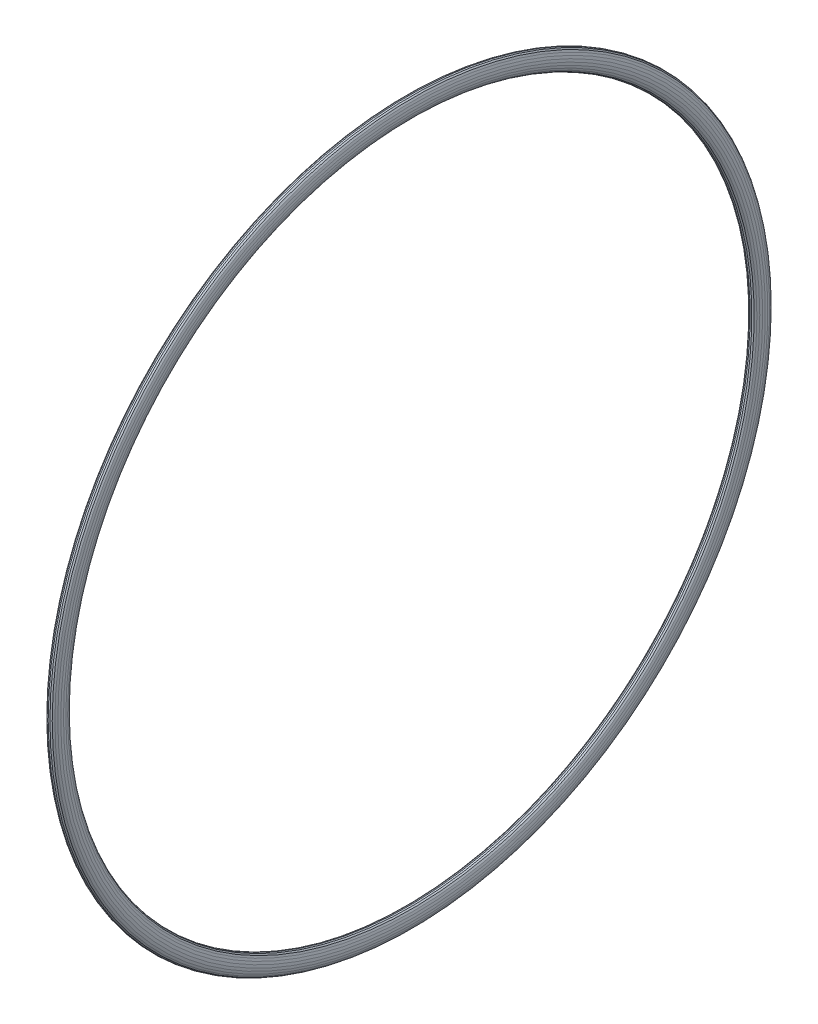
ISO-10303-21;
HEADER;
FILE_DESCRIPTION(('STEP AP214'),'2;1');
FILE_NAME('part.step','',(''),(''),'','','');
FILE_SCHEMA(('AUTOMOTIVE_DESIGN { 1 0 10303 214 1 1 1 1 }'));
ENDSEC;
DATA;
#1=APPLICATION_CONTEXT('core data for automotive mechanical design processes');
#2=APPLICATION_PROTOCOL_DEFINITION('international standard','automotive_design',2000,#1);
#3=PRODUCT_CONTEXT('',#1,'mechanical');
#4=PRODUCT('Part','Part','',(#3));
#5=PRODUCT_RELATED_PRODUCT_CATEGORY('part','',(#4));
#6=PRODUCT_DEFINITION_FORMATION('','',#4);
#7=PRODUCT_DEFINITION_CONTEXT('part definition',#1,'design');
#8=PRODUCT_DEFINITION('design','',#6,#7);
#9=PRODUCT_DEFINITION_SHAPE('','',#8);
#10=(LENGTH_UNIT() NAMED_UNIT(*) SI_UNIT(.MILLI.,.METRE.));
#11=(NAMED_UNIT(*) PLANE_ANGLE_UNIT() SI_UNIT($,.RADIAN.));
#12=(NAMED_UNIT(*) SI_UNIT($,.STERADIAN.) SOLID_ANGLE_UNIT());
#13=UNCERTAINTY_MEASURE_WITH_UNIT(LENGTH_MEASURE(1.E-05),#10,'distance_accuracy_value','');
#14=(GEOMETRIC_REPRESENTATION_CONTEXT(3) GLOBAL_UNCERTAINTY_ASSIGNED_CONTEXT((#13)) GLOBAL_UNIT_ASSIGNED_CONTEXT((#10,
#11,#12)) REPRESENTATION_CONTEXT('',''));
#15=CARTESIAN_POINT('',(0.,0.,0.));
#16=DIRECTION('',(0.,0.,1.));
#17=DIRECTION('',(1.,0.,0.));
#18=AXIS2_PLACEMENT_3D('',#15,#16,#17);
#19=CARTESIAN_POINT('',(-1.95500000000004,0.,0.));
#20=DIRECTION('',(-1.,0.,0.));
#21=DIRECTION('',(0.,0.,1.));
#22=AXIS2_PLACEMENT_3D('',#19,#20,#21);
#23=CONICAL_SURFACE('',#22,62.78,1.49799696442048);
#24=CARTESIAN_POINT('',(-1.92177768063184,0.,0.));
#25=DIRECTION('',(-1.,0.,0.));
#26=DIRECTION('',(0.,0.,1.));
#27=AXIS2_PLACEMENT_3D('',#24,#25,#26);
#28=CIRCLE('',#27,62.3244519350765);
#29=CARTESIAN_POINT('',(-1.92177768063184,0.,62.3244519350765));
#30=VERTEX_POINT('',#29);
#31=EDGE_CURVE('E113',#30,#30,#28,.T.);
#32=ORIENTED_EDGE('',*,*,#31,.F.);
#33=EDGE_LOOP('',(#32));
#34=FACE_BOUND('',#33,.T.);
#35=CARTESIAN_POINT('',(-1.95500000000004,0.,0.));
#36=DIRECTION('',(-1.,0.,0.));
#37=DIRECTION('',(0.,0.,1.));
#38=AXIS2_PLACEMENT_3D('',#35,#36,#37);
#39=CIRCLE('',#38,62.78);
#40=CARTESIAN_POINT('',(-1.95500000000004,0.,62.78));
#41=VERTEX_POINT('',#40);
#42=EDGE_CURVE('E10',#41,#41,#39,.T.);
#43=ORIENTED_EDGE('',*,*,#42,.T.);
#44=EDGE_LOOP('',(#43));
#45=FACE_BOUND('',#44,.T.);
#46=ADVANCED_FACE('F39',(#34,#45),#23,.F.);
#47=CARTESIAN_POINT('',(-1.92177768063184,0.,0.));
#48=DIRECTION('',(1.,0.,0.));
#49=DIRECTION('',(0.,0.,-1.));
#50=AXIS2_PLACEMENT_3D('',#47,#48,#49);
#51=CONICAL_SURFACE('',#50,63.2355480649235,1.49799696442048);
#52=ORIENTED_EDGE('',*,*,#42,.F.);
#53=EDGE_LOOP('',(#52));
#54=FACE_BOUND('',#53,.T.);
#55=CARTESIAN_POINT('',(-1.92177768063184,0.,0.));
#56=DIRECTION('',(-1.,0.,0.));
#57=DIRECTION('',(0.,0.,1.));
#58=AXIS2_PLACEMENT_3D('',#55,#56,#57);
#59=CIRCLE('',#58,63.2355480649235);
#60=CARTESIAN_POINT('',(-1.92177768063184,0.,63.2355480649235));
#61=VERTEX_POINT('',#60);
#62=EDGE_CURVE('E44',#61,#61,#59,.T.);
#63=ORIENTED_EDGE('',*,*,#62,.T.);
#64=EDGE_LOOP('',(#63));
#65=FACE_BOUND('',#64,.T.);
#66=ADVANCED_FACE('F125',(#54,#65),#51,.T.);
#67=CARTESIAN_POINT('',(-1.8243747686898,0.,0.));
#68=DIRECTION('',(1.,0.,0.));
#69=DIRECTION('',(0.,0.,-1.));
#70=AXIS2_PLACEMENT_3D('',#67,#68,#69);
#71=CONICAL_SURFACE('',#70,63.6600512820513,1.34524891644555);
#72=ORIENTED_EDGE('',*,*,#62,.F.);
#73=EDGE_LOOP('',(#72));
#74=FACE_BOUND('',#73,.T.);
#75=CARTESIAN_POINT('',(-1.8243747686898,0.,0.));
#76=DIRECTION('',(-1.,0.,0.));
#77=DIRECTION('',(0.,0.,1.));
#78=AXIS2_PLACEMENT_3D('',#75,#76,#77);
#79=CIRCLE('',#78,63.6600512820513);
#80=CARTESIAN_POINT('',(-1.8243747686898,0.,63.6600512820513));
#81=VERTEX_POINT('',#80);
#82=EDGE_CURVE('E47',#81,#81,#79,.T.);
#83=ORIENTED_EDGE('',*,*,#82,.T.);
#84=EDGE_LOOP('',(#83));
#85=FACE_BOUND('',#84,.T.);
#86=ADVANCED_FACE('F127',(#74,#85),#71,.T.);
#87=CARTESIAN_POINT('',(-1.66942911165691,0.,0.));
#88=DIRECTION('',(1.,0.,0.));
#89=DIRECTION('',(0.,0.,-1.));
#90=AXIS2_PLACEMENT_3D('',#87,#88,#89);
#91=CONICAL_SURFACE('',#90,64.0245804586608,1.16887745006469);
#92=ORIENTED_EDGE('',*,*,#82,.F.);
#93=EDGE_LOOP('',(#92));
#94=FACE_BOUND('',#93,.T.);
#95=CARTESIAN_POINT('',(-1.66942911165691,0.,0.));
#96=DIRECTION('',(-1.,0.,0.));
#97=DIRECTION('',(0.,0.,1.));
#98=AXIS2_PLACEMENT_3D('',#95,#96,#97);
#99=CIRCLE('',#98,64.0245804586608);
#100=CARTESIAN_POINT('',(-1.66942911165691,0.,64.0245804586608));
#101=VERTEX_POINT('',#100);
#102=EDGE_CURVE('E52',#101,#101,#99,.T.);
#103=ORIENTED_EDGE('',*,*,#102,.T.);
#104=EDGE_LOOP('',(#103));
#105=FACE_BOUND('',#104,.T.);
#106=ADVANCED_FACE('F132',(#94,#105),#91,.T.);
#107=CARTESIAN_POINT('',(-1.46749999999995,0.,0.));
#108=DIRECTION('',(1.,0.,0.));
#109=DIRECTION('',(0.,0.,-1.));
#110=AXIS2_PLACEMENT_3D('',#107,#108,#109);
#111=CONICAL_SURFACE('',#110,64.3042935337789,0.945513112154515);
#112=ORIENTED_EDGE('',*,*,#102,.F.);
#113=EDGE_LOOP('',(#112));
#114=FACE_BOUND('',#113,.T.);
#115=CARTESIAN_POINT('',(-1.46749999999995,0.,0.));
#116=DIRECTION('',(-1.,0.,0.));
#117=DIRECTION('',(0.,0.,1.));
#118=AXIS2_PLACEMENT_3D('',#115,#116,#117);
#119=CIRCLE('',#118,64.3042935337789);
#120=CARTESIAN_POINT('',(-1.46749999999995,0.,64.3042935337789));
#121=VERTEX_POINT('',#120);
#122=EDGE_CURVE('E59',#121,#121,#119,.T.);
#123=ORIENTED_EDGE('',*,*,#122,.T.);
#124=EDGE_LOOP('',(#123));
#125=FACE_BOUND('',#124,.T.);
#126=ADVANCED_FACE('F140',(#114,#125),#111,.T.);
#127=CARTESIAN_POINT('',(-1.23234856897492,0.,0.));
#128=DIRECTION('',(1.,0.,0.));
#129=DIRECTION('',(0.,0.,-1.));
#130=AXIS2_PLACEMENT_3D('',#127,#128,#129);
#131=CONICAL_SURFACE('',#130,64.4801285235843,0.642060936467495);
#132=ORIENTED_EDGE('',*,*,#122,.F.);
#133=EDGE_LOOP('',(#132));
#134=FACE_BOUND('',#133,.T.);
#135=CARTESIAN_POINT('',(-1.23234856897492,0.,0.));
#136=DIRECTION('',(-1.,0.,0.));
#137=DIRECTION('',(0.,0.,1.));
#138=AXIS2_PLACEMENT_3D('',#135,#136,#137);
#139=CIRCLE('',#138,64.4801285235843);
#140=CARTESIAN_POINT('',(-1.23234856897492,0.,64.4801285235843));
#141=VERTEX_POINT('',#140);
#142=EDGE_CURVE('E62',#141,#141,#139,.T.);
#143=ORIENTED_EDGE('',*,*,#142,.T.);
#144=EDGE_LOOP('',(#143));
#145=FACE_BOUND('',#144,.T.);
#146=ADVANCED_FACE('F143',(#134,#145),#131,.T.);
#147=CARTESIAN_POINT('',(-0.979999999999981,0.,0.));
#148=DIRECTION('',(1.,0.,0.));
#149=DIRECTION('',(0.,0.,-1.));
#150=AXIS2_PLACEMENT_3D('',#147,#148,#149);
#151=CONICAL_SURFACE('',#150,64.5401025641026,0.233334551441865);
#152=ORIENTED_EDGE('',*,*,#142,.F.);
#153=EDGE_LOOP('',(#152));
#154=FACE_BOUND('',#153,.T.);
#155=CARTESIAN_POINT('',(-0.979999999999981,0.,0.));
#156=DIRECTION('',(-1.,0.,0.));
#157=DIRECTION('',(0.,0.,1.));
#158=AXIS2_PLACEMENT_3D('',#155,#156,#157);
#159=CIRCLE('',#158,64.5401025641026);
#160=CARTESIAN_POINT('',(-0.979999999999981,0.,64.5401025641026));
#161=VERTEX_POINT('',#160);
#162=EDGE_CURVE('E61',#161,#161,#159,.T.);
#163=ORIENTED_EDGE('',*,*,#162,.T.);
#164=EDGE_LOOP('',(#163));
#165=FACE_BOUND('',#164,.T.);
#166=ADVANCED_FACE('F144',(#154,#165),#151,.T.);
#167=CARTESIAN_POINT('',(-0.727651431025045,0.,0.));
#168=DIRECTION('',(-1.,0.,0.));
#169=DIRECTION('',(0.,0.,1.));
#170=AXIS2_PLACEMENT_3D('',#167,#168,#169);
#171=CONICAL_SURFACE('',#170,64.4801285235843,0.233334551441865);
#172=ORIENTED_EDGE('',*,*,#162,.F.);
#173=EDGE_LOOP('',(#172));
#174=FACE_BOUND('',#173,.T.);
#175=CARTESIAN_POINT('',(-0.727651431025045,0.,0.));
#176=DIRECTION('',(-1.,0.,0.));
#177=DIRECTION('',(0.,0.,1.));
#178=AXIS2_PLACEMENT_3D('',#175,#176,#177);
#179=CIRCLE('',#178,64.4801285235843);
#180=CARTESIAN_POINT('',(-0.727651431025045,0.,64.4801285235843));
#181=VERTEX_POINT('',#180);
#182=EDGE_CURVE('E70',#181,#181,#179,.T.);
#183=ORIENTED_EDGE('',*,*,#182,.T.);
#184=EDGE_LOOP('',(#183));
#185=FACE_BOUND('',#184,.T.);
#186=ADVANCED_FACE('F149',(#174,#185),#171,.T.);
#187=CARTESIAN_POINT('',(-0.492500000000007,0.,0.));
#188=DIRECTION('',(-1.,0.,0.));
#189=DIRECTION('',(0.,0.,1.));
#190=AXIS2_PLACEMENT_3D('',#187,#188,#189);
#191=CONICAL_SURFACE('',#190,64.3042935337789,0.642060936467495);
#192=ORIENTED_EDGE('',*,*,#182,.F.);
#193=EDGE_LOOP('',(#192));
#194=FACE_BOUND('',#193,.T.);
#195=CARTESIAN_POINT('',(-0.492500000000007,0.,0.));
#196=DIRECTION('',(-1.,0.,0.));
#197=DIRECTION('',(0.,0.,1.));
#198=AXIS2_PLACEMENT_3D('',#195,#196,#197);
#199=CIRCLE('',#198,64.3042935337789);
#200=CARTESIAN_POINT('',(-0.492500000000007,0.,64.3042935337789));
#201=VERTEX_POINT('',#200);
#202=EDGE_CURVE('E68',#201,#201,#199,.T.);
#203=ORIENTED_EDGE('',*,*,#202,.T.);
#204=EDGE_LOOP('',(#203));
#205=FACE_BOUND('',#204,.T.);
#206=ADVANCED_FACE('F153',(#194,#205),#191,.T.);
#207=CARTESIAN_POINT('',(-0.290570888343167,0.,0.));
#208=DIRECTION('',(-1.,0.,0.));
#209=DIRECTION('',(0.,0.,1.));
#210=AXIS2_PLACEMENT_3D('',#207,#208,#209);
#211=CONICAL_SURFACE('',#210,64.0245804586608,0.945513112154776);
#212=ORIENTED_EDGE('',*,*,#202,.F.);
#213=EDGE_LOOP('',(#212));
#214=FACE_BOUND('',#213,.T.);
#215=CARTESIAN_POINT('',(-0.290570888343167,0.,0.));
#216=DIRECTION('',(-1.,0.,0.));
#217=DIRECTION('',(0.,0.,1.));
#218=AXIS2_PLACEMENT_3D('',#215,#216,#217);
#219=CIRCLE('',#218,64.0245804586608);
#220=CARTESIAN_POINT('',(-0.290570888343167,0.,64.0245804586608));
#221=VERTEX_POINT('',#220);
#222=EDGE_CURVE('E71',#221,#221,#219,.T.);
#223=ORIENTED_EDGE('',*,*,#222,.T.);
#224=EDGE_LOOP('',(#223));
#225=FACE_BOUND('',#224,.T.);
#226=ADVANCED_FACE('F160',(#214,#225),#211,.T.);
#227=CARTESIAN_POINT('',(-0.135625231310166,0.,0.));
#228=DIRECTION('',(-1.,0.,0.));
#229=DIRECTION('',(0.,0.,1.));
#230=AXIS2_PLACEMENT_3D('',#227,#228,#229);
#231=CONICAL_SURFACE('',#230,63.6600512820513,1.16887745006443);
#232=ORIENTED_EDGE('',*,*,#222,.F.);
#233=EDGE_LOOP('',(#232));
#234=FACE_BOUND('',#233,.T.);
#235=CARTESIAN_POINT('',(-0.135625231310166,0.,0.));
#236=DIRECTION('',(-1.,0.,0.));
#237=DIRECTION('',(0.,0.,1.));
#238=AXIS2_PLACEMENT_3D('',#235,#236,#237);
#239=CIRCLE('',#238,63.6600512820513);
#240=CARTESIAN_POINT('',(-0.135625231310166,0.,63.6600512820513));
#241=VERTEX_POINT('',#240);
#242=EDGE_CURVE('E77',#241,#241,#239,.T.);
#243=ORIENTED_EDGE('',*,*,#242,.T.);
#244=EDGE_LOOP('',(#243));
#245=FACE_BOUND('',#244,.T.);
#246=ADVANCED_FACE('F161',(#234,#245),#231,.T.);
#247=CARTESIAN_POINT('',(-0.0382223193681197,0.,0.));
#248=DIRECTION('',(-1.,0.,0.));
#249=DIRECTION('',(0.,0.,1.));
#250=AXIS2_PLACEMENT_3D('',#247,#248,#249);
#251=CONICAL_SURFACE('',#250,63.2355480649235,1.34524891644555);
#252=ORIENTED_EDGE('',*,*,#242,.F.);
#253=EDGE_LOOP('',(#252));
#254=FACE_BOUND('',#253,.T.);
#255=CARTESIAN_POINT('',(-0.0382223193681197,0.,0.));
#256=DIRECTION('',(-1.,0.,0.));
#257=DIRECTION('',(0.,0.,1.));
#258=AXIS2_PLACEMENT_3D('',#255,#256,#257);
#259=CIRCLE('',#258,63.2355480649235);
#260=CARTESIAN_POINT('',(-0.0382223193681197,0.,63.2355480649235));
#261=VERTEX_POINT('',#260);
#262=EDGE_CURVE('E76',#261,#261,#259,.T.);
#263=ORIENTED_EDGE('',*,*,#262,.T.);
#264=EDGE_LOOP('',(#263));
#265=FACE_BOUND('',#264,.T.);
#266=ADVANCED_FACE('F164',(#254,#265),#251,.T.);
#267=CARTESIAN_POINT('',(-0.00500000000003276,0.,0.));
#268=DIRECTION('',(-1.,0.,0.));
#269=DIRECTION('',(0.,0.,1.));
#270=AXIS2_PLACEMENT_3D('',#267,#268,#269);
#271=CONICAL_SURFACE('',#270,62.78,1.49799696442072);
#272=ORIENTED_EDGE('',*,*,#262,.F.);
#273=EDGE_LOOP('',(#272));
#274=FACE_BOUND('',#273,.T.);
#275=CARTESIAN_POINT('',(-0.00500000000003276,0.,0.));
#276=DIRECTION('',(-1.,0.,0.));
#277=DIRECTION('',(0.,0.,1.));
#278=AXIS2_PLACEMENT_3D('',#275,#276,#277);
#279=CIRCLE('',#278,62.78);
#280=CARTESIAN_POINT('',(-0.00500000000003276,0.,62.78));
#281=VERTEX_POINT('',#280);
#282=EDGE_CURVE('E85',#281,#281,#279,.T.);
#283=ORIENTED_EDGE('',*,*,#282,.T.);
#284=EDGE_LOOP('',(#283));
#285=FACE_BOUND('',#284,.T.);
#286=ADVANCED_FACE('F166',(#274,#285),#271,.T.);
#287=CARTESIAN_POINT('',(-0.0382223193681197,0.,0.));
#288=DIRECTION('',(1.,0.,0.));
#289=DIRECTION('',(0.,0.,-1.));
#290=AXIS2_PLACEMENT_3D('',#287,#288,#289);
#291=CONICAL_SURFACE('',#290,62.3244519350765,1.49799696442072);
#292=ORIENTED_EDGE('',*,*,#282,.F.);
#293=EDGE_LOOP('',(#292));
#294=FACE_BOUND('',#293,.T.);
#295=CARTESIAN_POINT('',(-0.0382223193681197,0.,0.));
#296=DIRECTION('',(-1.,0.,0.));
#297=DIRECTION('',(0.,0.,1.));
#298=AXIS2_PLACEMENT_3D('',#295,#296,#297);
#299=CIRCLE('',#298,62.3244519350765);
#300=CARTESIAN_POINT('',(-0.0382223193681197,0.,62.3244519350765));
#301=VERTEX_POINT('',#300);
#302=EDGE_CURVE('E83',#301,#301,#299,.T.);
#303=ORIENTED_EDGE('',*,*,#302,.T.);
#304=EDGE_LOOP('',(#303));
#305=FACE_BOUND('',#304,.T.);
#306=ADVANCED_FACE('F174',(#294,#305),#291,.F.);
#307=CARTESIAN_POINT('',(-0.135625231310166,0.,0.));
#308=DIRECTION('',(1.,0.,0.));
#309=DIRECTION('',(0.,0.,-1.));
#310=AXIS2_PLACEMENT_3D('',#307,#308,#309);
#311=CONICAL_SURFACE('',#310,61.8999487179487,1.34524891644555);
#312=ORIENTED_EDGE('',*,*,#302,.F.);
#313=EDGE_LOOP('',(#312));
#314=FACE_BOUND('',#313,.T.);
#315=CARTESIAN_POINT('',(-0.135625231310166,0.,0.));
#316=DIRECTION('',(-1.,0.,0.));
#317=DIRECTION('',(0.,0.,1.));
#318=AXIS2_PLACEMENT_3D('',#315,#316,#317);
#319=CIRCLE('',#318,61.8999487179487);
#320=CARTESIAN_POINT('',(-0.135625231310166,0.,61.8999487179487));
#321=VERTEX_POINT('',#320);
#322=EDGE_CURVE('E86',#321,#321,#319,.T.);
#323=ORIENTED_EDGE('',*,*,#322,.T.);
#324=EDGE_LOOP('',(#323));
#325=FACE_BOUND('',#324,.T.);
#326=ADVANCED_FACE('F180',(#314,#325),#311,.F.);
#327=CARTESIAN_POINT('',(-0.290570888343167,0.,0.));
#328=DIRECTION('',(1.,0.,0.));
#329=DIRECTION('',(0.,0.,-1.));
#330=AXIS2_PLACEMENT_3D('',#327,#328,#329);
#331=CONICAL_SURFACE('',#330,61.5354195413393,1.16887745006443);
#332=ORIENTED_EDGE('',*,*,#322,.F.);
#333=EDGE_LOOP('',(#332));
#334=FACE_BOUND('',#333,.T.);
#335=CARTESIAN_POINT('',(-0.290570888343167,0.,0.));
#336=DIRECTION('',(-1.,0.,0.));
#337=DIRECTION('',(0.,0.,1.));
#338=AXIS2_PLACEMENT_3D('',#335,#336,#337);
#339=CIRCLE('',#338,61.5354195413393);
#340=CARTESIAN_POINT('',(-0.290570888343167,0.,61.5354195413393));
#341=VERTEX_POINT('',#340);
#342=EDGE_CURVE('E93',#341,#341,#339,.T.);
#343=ORIENTED_EDGE('',*,*,#342,.T.);
#344=EDGE_LOOP('',(#343));
#345=FACE_BOUND('',#344,.T.);
#346=ADVANCED_FACE('F182',(#334,#345),#331,.F.);
#347=CARTESIAN_POINT('',(-0.492500000000007,0.,0.));
#348=DIRECTION('',(1.,0.,0.));
#349=DIRECTION('',(0.,0.,-1.));
#350=AXIS2_PLACEMENT_3D('',#347,#348,#349);
#351=CONICAL_SURFACE('',#350,61.255706466221,0.945513112154776);
#352=ORIENTED_EDGE('',*,*,#342,.F.);
#353=EDGE_LOOP('',(#352));
#354=FACE_BOUND('',#353,.T.);
#355=CARTESIAN_POINT('',(-0.492500000000007,0.,0.));
#356=DIRECTION('',(-1.,0.,0.));
#357=DIRECTION('',(0.,0.,1.));
#358=AXIS2_PLACEMENT_3D('',#355,#356,#357);
#359=CIRCLE('',#358,61.255706466221);
#360=CARTESIAN_POINT('',(-0.492500000000007,0.,61.255706466221));
#361=VERTEX_POINT('',#360);
#362=EDGE_CURVE('E94',#361,#361,#359,.T.);
#363=ORIENTED_EDGE('',*,*,#362,.T.);
#364=EDGE_LOOP('',(#363));
#365=FACE_BOUND('',#364,.T.);
#366=ADVANCED_FACE('F183',(#354,#365),#351,.F.);
#367=CARTESIAN_POINT('',(-0.727651431025045,0.,0.));
#368=DIRECTION('',(1.,0.,0.));
#369=DIRECTION('',(0.,0.,-1.));
#370=AXIS2_PLACEMENT_3D('',#367,#368,#369);
#371=CONICAL_SURFACE('',#370,61.0798714764157,0.642060936467457);
#372=ORIENTED_EDGE('',*,*,#362,.F.);
#373=EDGE_LOOP('',(#372));
#374=FACE_BOUND('',#373,.T.);
#375=CARTESIAN_POINT('',(-0.727651431025045,0.,0.));
#376=DIRECTION('',(-1.,0.,0.));
#377=DIRECTION('',(0.,0.,1.));
#378=AXIS2_PLACEMENT_3D('',#375,#376,#377);
#379=CIRCLE('',#378,61.0798714764157);
#380=CARTESIAN_POINT('',(-0.727651431025045,0.,61.0798714764157));
#381=VERTEX_POINT('',#380);
#382=EDGE_CURVE('E100',#381,#381,#379,.T.);
#383=ORIENTED_EDGE('',*,*,#382,.T.);
#384=EDGE_LOOP('',(#383));
#385=FACE_BOUND('',#384,.T.);
#386=ADVANCED_FACE('F186',(#374,#385),#371,.F.);
#387=CARTESIAN_POINT('',(-0.979999999999981,0.,0.));
#388=DIRECTION('',(1.,0.,0.));
#389=DIRECTION('',(0.,0.,-1.));
#390=AXIS2_PLACEMENT_3D('',#387,#388,#389);
#391=CONICAL_SURFACE('',#390,61.0198974358974,0.233334551441891);
#392=ORIENTED_EDGE('',*,*,#382,.F.);
#393=EDGE_LOOP('',(#392));
#394=FACE_BOUND('',#393,.T.);
#395=CARTESIAN_POINT('',(-0.979999999999981,0.,0.));
#396=DIRECTION('',(-1.,0.,0.));
#397=DIRECTION('',(0.,0.,1.));
#398=AXIS2_PLACEMENT_3D('',#395,#396,#397);
#399=CIRCLE('',#398,61.0198974358974);
#400=CARTESIAN_POINT('',(-0.979999999999981,0.,61.0198974358974));
#401=VERTEX_POINT('',#400);
#402=EDGE_CURVE('E99',#401,#401,#399,.T.);
#403=ORIENTED_EDGE('',*,*,#402,.T.);
#404=EDGE_LOOP('',(#403));
#405=FACE_BOUND('',#404,.T.);
#406=ADVANCED_FACE('F194',(#394,#405),#391,.F.);
#407=CARTESIAN_POINT('',(-1.23234856897492,0.,0.));
#408=DIRECTION('',(-1.,0.,0.));
#409=DIRECTION('',(0.,0.,1.));
#410=AXIS2_PLACEMENT_3D('',#407,#408,#409);
#411=CONICAL_SURFACE('',#410,61.0798714764157,0.233334551441891);
#412=ORIENTED_EDGE('',*,*,#402,.F.);
#413=EDGE_LOOP('',(#412));
#414=FACE_BOUND('',#413,.T.);
#415=CARTESIAN_POINT('',(-1.23234856897492,0.,0.));
#416=DIRECTION('',(-1.,0.,0.));
#417=DIRECTION('',(0.,0.,1.));
#418=AXIS2_PLACEMENT_3D('',#415,#416,#417);
#419=CIRCLE('',#418,61.0798714764157);
#420=CARTESIAN_POINT('',(-1.23234856897492,0.,61.0798714764157));
#421=VERTEX_POINT('',#420);
#422=EDGE_CURVE('E103',#421,#421,#419,.T.);
#423=ORIENTED_EDGE('',*,*,#422,.T.);
#424=EDGE_LOOP('',(#423));
#425=FACE_BOUND('',#424,.T.);
#426=ADVANCED_FACE('F197',(#414,#425),#411,.F.);
#427=CARTESIAN_POINT('',(-1.46749999999995,0.,0.));
#428=DIRECTION('',(-1.,0.,0.));
#429=DIRECTION('',(0.,0.,1.));
#430=AXIS2_PLACEMENT_3D('',#427,#428,#429);
#431=CONICAL_SURFACE('',#430,61.255706466221,0.642060936467457);
#432=ORIENTED_EDGE('',*,*,#422,.F.);
#433=EDGE_LOOP('',(#432));
#434=FACE_BOUND('',#433,.T.);
#435=CARTESIAN_POINT('',(-1.46749999999995,0.,0.));
#436=DIRECTION('',(-1.,0.,0.));
#437=DIRECTION('',(0.,0.,1.));
#438=AXIS2_PLACEMENT_3D('',#435,#436,#437);
#439=CIRCLE('',#438,61.255706466221);
#440=CARTESIAN_POINT('',(-1.46749999999995,0.,61.255706466221));
#441=VERTEX_POINT('',#440);
#442=EDGE_CURVE('E106',#441,#441,#439,.T.);
#443=ORIENTED_EDGE('',*,*,#442,.T.);
#444=EDGE_LOOP('',(#443));
#445=FACE_BOUND('',#444,.T.);
#446=ADVANCED_FACE('F203',(#434,#445),#431,.F.);
#447=CARTESIAN_POINT('',(-1.66942911165691,0.,0.));
#448=DIRECTION('',(-1.,0.,0.));
#449=DIRECTION('',(0.,0.,1.));
#450=AXIS2_PLACEMENT_3D('',#447,#448,#449);
#451=CONICAL_SURFACE('',#450,61.5354195413392,0.945513112154503);
#452=ORIENTED_EDGE('',*,*,#442,.F.);
#453=EDGE_LOOP('',(#452));
#454=FACE_BOUND('',#453,.T.);
#455=CARTESIAN_POINT('',(-1.66942911165691,0.,0.));
#456=DIRECTION('',(-1.,0.,0.));
#457=DIRECTION('',(0.,0.,1.));
#458=AXIS2_PLACEMENT_3D('',#455,#456,#457);
#459=CIRCLE('',#458,61.5354195413392);
#460=CARTESIAN_POINT('',(-1.66942911165691,0.,61.5354195413392));
#461=VERTEX_POINT('',#460);
#462=EDGE_CURVE('E108',#461,#461,#459,.T.);
#463=ORIENTED_EDGE('',*,*,#462,.T.);
#464=EDGE_LOOP('',(#463));
#465=FACE_BOUND('',#464,.T.);
#466=ADVANCED_FACE('F202',(#454,#465),#451,.F.);
#467=CARTESIAN_POINT('',(-1.8243747686898,0.,0.));
#468=DIRECTION('',(-1.,0.,0.));
#469=DIRECTION('',(0.,0.,1.));
#470=AXIS2_PLACEMENT_3D('',#467,#468,#469);
#471=CONICAL_SURFACE('',#470,61.8999487179487,1.1688774500647);
#472=ORIENTED_EDGE('',*,*,#462,.F.);
#473=EDGE_LOOP('',(#472));
#474=FACE_BOUND('',#473,.T.);
#475=CARTESIAN_POINT('',(-1.8243747686898,0.,0.));
#476=DIRECTION('',(-1.,0.,0.));
#477=DIRECTION('',(0.,0.,1.));
#478=AXIS2_PLACEMENT_3D('',#475,#476,#477);
#479=CIRCLE('',#478,61.8999487179487);
#480=CARTESIAN_POINT('',(-1.8243747686898,0.,61.8999487179487));
#481=VERTEX_POINT('',#480);
#482=EDGE_CURVE('E115',#481,#481,#479,.T.);
#483=ORIENTED_EDGE('',*,*,#482,.T.);
#484=EDGE_LOOP('',(#483));
#485=FACE_BOUND('',#484,.T.);
#486=ADVANCED_FACE('F207',(#474,#485),#471,.F.);
#487=CARTESIAN_POINT('',(-1.92177768063184,0.,0.));
#488=DIRECTION('',(-1.,0.,0.));
#489=DIRECTION('',(0.,0.,1.));
#490=AXIS2_PLACEMENT_3D('',#487,#488,#489);
#491=CONICAL_SURFACE('',#490,62.3244519350765,1.34524891644555);
#492=ORIENTED_EDGE('',*,*,#482,.F.);
#493=EDGE_LOOP('',(#492));
#494=FACE_BOUND('',#493,.T.);
#495=ORIENTED_EDGE('',*,*,#31,.T.);
#496=EDGE_LOOP('',(#495));
#497=FACE_BOUND('',#496,.T.);
#498=ADVANCED_FACE('F116',(#494,#497),#491,.F.);
#499=CLOSED_SHELL('',(#46,#66,#86,#106,#126,#146,#166,#186,#206,#226,#246,#266,#286,#306,#326,
#346,#366,#386,#406,#426,#446,#466,#486,#498));
#500=MANIFOLD_SOLID_BREP('B2',#499);
#501=ADVANCED_BREP_SHAPE_REPRESENTATION('',(#18,#500),#14);
#502=SHAPE_DEFINITION_REPRESENTATION(#9,#501);
ENDSEC;
END-ISO-10303-21;
